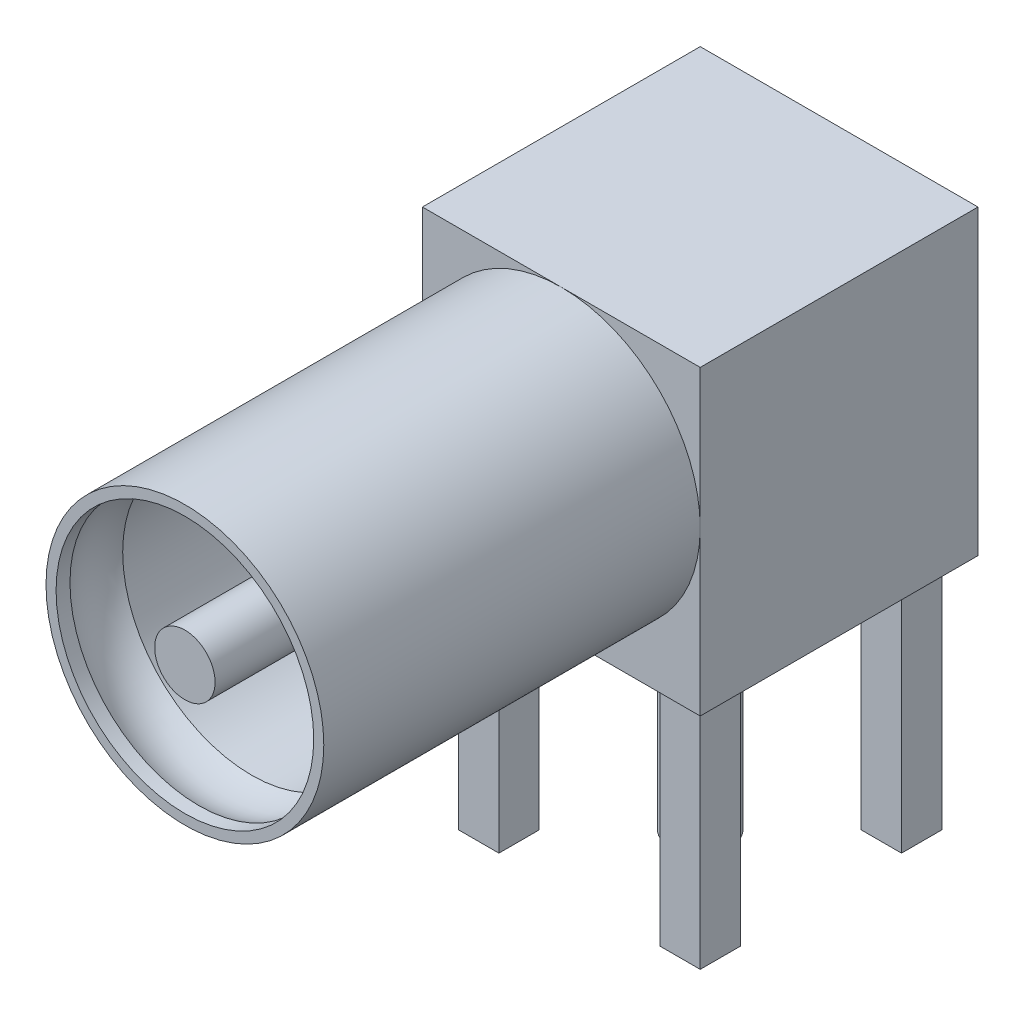
ISO-10303-21;
HEADER;
FILE_DESCRIPTION(('STEP AP214'),'2;1');
FILE_NAME('part.step','',(''),(''),'','','');
FILE_SCHEMA(('AUTOMOTIVE_DESIGN { 1 0 10303 214 1 1 1 1 }'));
ENDSEC;
DATA;
#1=APPLICATION_CONTEXT('core data for automotive mechanical design processes');
#2=APPLICATION_PROTOCOL_DEFINITION('international standard','automotive_design',2000,#1);
#3=PRODUCT_CONTEXT('',#1,'mechanical');
#4=PRODUCT('Part','Part','',(#3));
#5=PRODUCT_RELATED_PRODUCT_CATEGORY('part','',(#4));
#6=PRODUCT_DEFINITION_FORMATION('','',#4);
#7=PRODUCT_DEFINITION_CONTEXT('part definition',#1,'design');
#8=PRODUCT_DEFINITION('design','',#6,#7);
#9=PRODUCT_DEFINITION_SHAPE('','',#8);
#10=(LENGTH_UNIT() NAMED_UNIT(*) SI_UNIT(.MILLI.,.METRE.));
#11=(NAMED_UNIT(*) PLANE_ANGLE_UNIT() SI_UNIT($,.RADIAN.));
#12=(NAMED_UNIT(*) SI_UNIT($,.STERADIAN.) SOLID_ANGLE_UNIT());
#13=UNCERTAINTY_MEASURE_WITH_UNIT(LENGTH_MEASURE(1.E-05),#10,'distance_accuracy_value','');
#14=(GEOMETRIC_REPRESENTATION_CONTEXT(3) GLOBAL_UNCERTAINTY_ASSIGNED_CONTEXT((#13)) GLOBAL_UNIT_ASSIGNED_CONTEXT((#10,
#11,#12)) REPRESENTATION_CONTEXT('',''));
#15=CARTESIAN_POINT('',(0.,0.,0.));
#16=DIRECTION('',(0.,0.,1.));
#17=DIRECTION('',(1.,0.,0.));
#18=AXIS2_PLACEMENT_3D('',#15,#16,#17);
#19=CARTESIAN_POINT('',(0.,2.0574,4.2164));
#20=DIRECTION('',(0.,0.,1.));
#21=DIRECTION('',(1.,0.,0.));
#22=AXIS2_PLACEMENT_3D('',#19,#20,#21);
#23=CYLINDRICAL_SURFACE('',#22,1.6256);
#24=CARTESIAN_POINT('',(0.,2.0574,6.3270333416842));
#25=DIRECTION('',(0.,0.,-1.));
#26=DIRECTION('',(-1.,0.,0.));
#27=AXIS2_PLACEMENT_3D('',#24,#25,#26);
#28=CIRCLE('',#27,1.6256);
#29=CARTESIAN_POINT('',(-1.6256,2.0574,6.3270333416842));
#30=VERTEX_POINT('',#29);
#31=EDGE_CURVE('E710',#30,#30,#28,.T.);
#32=ORIENTED_EDGE('',*,*,#31,.T.);
#33=EDGE_LOOP('',(#32));
#34=FACE_BOUND('',#33,.T.);
#35=CARTESIAN_POINT('',(0.,2.0574,6.5024));
#36=DIRECTION('',(0.,0.,1.));
#37=DIRECTION('',(1.,0.,0.));
#38=AXIS2_PLACEMENT_3D('',#35,#36,#37);
#39=CIRCLE('',#38,1.6256);
#40=CARTESIAN_POINT('',(1.6256,2.0574,6.5024));
#41=VERTEX_POINT('',#40);
#42=EDGE_CURVE('E407',#41,#41,#39,.T.);
#43=ORIENTED_EDGE('',*,*,#42,.T.);
#44=EDGE_LOOP('',(#43));
#45=FACE_BOUND('',#44,.T.);
#46=ADVANCED_FACE('F35',(#34,#45),#23,.F.);
#47=CARTESIAN_POINT('',(0.,0.,0.));
#48=DIRECTION('',(0.,-1.,0.));
#49=DIRECTION('',(0.,0.,-1.));
#50=AXIS2_PLACEMENT_3D('',#47,#48,#49);
#51=PLANE('',#50);
#52=CARTESIAN_POINT('',(0.,0.,0.));
#53=DIRECTION('',(0.,-1.,0.));
#54=DIRECTION('',(0.,0.,-1.));
#55=AXIS2_PLACEMENT_3D('',#52,#53,#54);
#56=CIRCLE('',#55,1.27);
#57=CARTESIAN_POINT('',(0.,0.,-1.27));
#58=VERTEX_POINT('',#57);
#59=EDGE_CURVE('E410',#58,#58,#56,.T.);
#60=ORIENTED_EDGE('',*,*,#59,.F.);
#61=EDGE_LOOP('',(#60));
#62=FACE_BOUND('',#61,.T.);
#63=DIRECTION('',(0.,0.,-1.));
#64=VECTOR('',#63,1.);
#65=CARTESIAN_POINT('',(1.7526,0.,1.7526));
#66=LINE('',#65,#64);
#67=CARTESIAN_POINT('',(1.7526,0.,1.7526));
#68=VERTEX_POINT('',#67);
#69=CARTESIAN_POINT('',(1.7526,0.,-1.7526));
#70=VERTEX_POINT('',#69);
#71=EDGE_CURVE('E304',#68,#70,#66,.T.);
#72=ORIENTED_EDGE('',*,*,#71,.F.);
#73=DIRECTION('',(1.,0.,0.));
#74=VECTOR('',#73,1.);
#75=CARTESIAN_POINT('',(-1.7526,0.,1.7526));
#76=LINE('',#75,#74);
#77=CARTESIAN_POINT('',(-1.7526,0.,1.7526));
#78=VERTEX_POINT('',#77);
#79=EDGE_CURVE('E311',#78,#68,#76,.T.);
#80=ORIENTED_EDGE('',*,*,#79,.F.);
#81=DIRECTION('',(0.,0.,1.));
#82=VECTOR('',#81,1.);
#83=CARTESIAN_POINT('',(-1.7526,0.,1.7526));
#84=LINE('',#83,#82);
#85=CARTESIAN_POINT('',(-1.7526,0.,-1.7526));
#86=VERTEX_POINT('',#85);
#87=EDGE_CURVE('E324',#86,#78,#84,.T.);
#88=ORIENTED_EDGE('',*,*,#87,.F.);
#89=DIRECTION('',(-1.,0.,0.));
#90=VECTOR('',#89,1.);
#91=CARTESIAN_POINT('',(-1.7526,0.,-1.7526));
#92=LINE('',#91,#90);
#93=EDGE_CURVE('E322',#70,#86,#92,.T.);
#94=ORIENTED_EDGE('',*,*,#93,.F.);
#95=EDGE_LOOP('',(#72,#80,#88,#94));
#96=FACE_BOUND('',#95,.T.);
#97=DIRECTION('',(1.,0.,0.));
#98=VECTOR('',#97,1.);
#99=CARTESIAN_POINT('',(1.524,0.,1.016));
#100=LINE('',#99,#98);
#101=CARTESIAN_POINT('',(1.016,0.,1.016));
#102=VERTEX_POINT('',#101);
#103=CARTESIAN_POINT('',(1.524,0.,1.016));
#104=VERTEX_POINT('',#103);
#105=EDGE_CURVE('E287',#102,#104,#100,.T.);
#106=ORIENTED_EDGE('',*,*,#105,.F.);
#107=DIRECTION('',(0.,0.,-1.));
#108=VECTOR('',#107,1.);
#109=CARTESIAN_POINT('',(1.016,0.,1.524));
#110=LINE('',#109,#108);
#111=CARTESIAN_POINT('',(1.016,0.,1.524));
#112=VERTEX_POINT('',#111);
#113=EDGE_CURVE('E273',#112,#102,#110,.T.);
#114=ORIENTED_EDGE('',*,*,#113,.F.);
#115=DIRECTION('',(-1.,0.,0.));
#116=VECTOR('',#115,1.);
#117=CARTESIAN_POINT('',(1.524,0.,1.524));
#118=LINE('',#117,#116);
#119=CARTESIAN_POINT('',(1.524,0.,1.524));
#120=VERTEX_POINT('',#119);
#121=EDGE_CURVE('E278',#120,#112,#118,.T.);
#122=ORIENTED_EDGE('',*,*,#121,.F.);
#123=DIRECTION('',(0.,0.,1.));
#124=VECTOR('',#123,1.);
#125=CARTESIAN_POINT('',(1.524,0.,1.524));
#126=LINE('',#125,#124);
#127=EDGE_CURVE('E289',#104,#120,#126,.T.);
#128=ORIENTED_EDGE('',*,*,#127,.F.);
#129=EDGE_LOOP('',(#106,#114,#122,#128));
#130=FACE_BOUND('',#129,.T.);
#131=DIRECTION('',(0.,0.,1.));
#132=VECTOR('',#131,1.);
#133=CARTESIAN_POINT('',(-1.016,0.,1.524));
#134=LINE('',#133,#132);
#135=CARTESIAN_POINT('',(-1.016,0.,1.016));
#136=VERTEX_POINT('',#135);
#137=CARTESIAN_POINT('',(-1.016,0.,1.524));
#138=VERTEX_POINT('',#137);
#139=EDGE_CURVE('E255',#136,#138,#134,.T.);
#140=ORIENTED_EDGE('',*,*,#139,.F.);
#141=DIRECTION('',(1.,0.,0.));
#142=VECTOR('',#141,1.);
#143=CARTESIAN_POINT('',(-1.016,0.,1.016));
#144=LINE('',#143,#142);
#145=CARTESIAN_POINT('',(-1.524,0.,1.016));
#146=VERTEX_POINT('',#145);
#147=EDGE_CURVE('E241',#146,#136,#144,.T.);
#148=ORIENTED_EDGE('',*,*,#147,.F.);
#149=DIRECTION('',(0.,0.,-1.));
#150=VECTOR('',#149,1.);
#151=CARTESIAN_POINT('',(-1.524,0.,1.524));
#152=LINE('',#151,#150);
#153=CARTESIAN_POINT('',(-1.524,0.,1.524));
#154=VERTEX_POINT('',#153);
#155=EDGE_CURVE('E246',#154,#146,#152,.T.);
#156=ORIENTED_EDGE('',*,*,#155,.F.);
#157=DIRECTION('',(-1.,0.,0.));
#158=VECTOR('',#157,1.);
#159=CARTESIAN_POINT('',(-1.016,0.,1.524));
#160=LINE('',#159,#158);
#161=EDGE_CURVE('E257',#138,#154,#160,.T.);
#162=ORIENTED_EDGE('',*,*,#161,.F.);
#163=EDGE_LOOP('',(#140,#148,#156,#162));
#164=FACE_BOUND('',#163,.T.);
#165=DIRECTION('',(0.,0.,1.));
#166=VECTOR('',#165,1.);
#167=CARTESIAN_POINT('',(-1.01599999999997,0.,-1.016));
#168=LINE('',#167,#166);
#169=CARTESIAN_POINT('',(-1.01599999999997,0.,-1.524));
#170=VERTEX_POINT('',#169);
#171=CARTESIAN_POINT('',(-1.01599999999997,0.,-1.016));
#172=VERTEX_POINT('',#171);
#173=EDGE_CURVE('E213',#170,#172,#168,.T.);
#174=ORIENTED_EDGE('',*,*,#173,.F.);
#175=DIRECTION('',(1.,0.,0.));
#176=VECTOR('',#175,1.);
#177=CARTESIAN_POINT('',(-1.01599999999997,0.,-1.524));
#178=LINE('',#177,#176);
#179=CARTESIAN_POINT('',(-1.52399999999997,0.,-1.524));
#180=VERTEX_POINT('',#179);
#181=EDGE_CURVE('E210',#180,#170,#178,.T.);
#182=ORIENTED_EDGE('',*,*,#181,.F.);
#183=DIRECTION('',(0.,0.,-1.));
#184=VECTOR('',#183,1.);
#185=CARTESIAN_POINT('',(-1.52399999999997,0.,-1.016));
#186=LINE('',#185,#184);
#187=CARTESIAN_POINT('',(-1.52399999999997,0.,-1.016));
#188=VERTEX_POINT('',#187);
#189=EDGE_CURVE('E222',#188,#180,#186,.T.);
#190=ORIENTED_EDGE('',*,*,#189,.F.);
#191=DIRECTION('',(-1.,0.,0.));
#192=VECTOR('',#191,1.);
#193=CARTESIAN_POINT('',(-1.01599999999997,0.,-1.016));
#194=LINE('',#193,#192);
#195=EDGE_CURVE('E230',#172,#188,#194,.T.);
#196=ORIENTED_EDGE('',*,*,#195,.F.);
#197=EDGE_LOOP('',(#174,#182,#190,#196));
#198=FACE_BOUND('',#197,.T.);
#199=DIRECTION('',(0.,0.,1.));
#200=VECTOR('',#199,1.);
#201=CARTESIAN_POINT('',(1.52400000000003,0.,-1.016));
#202=LINE('',#201,#200);
#203=CARTESIAN_POINT('',(1.52400000000003,0.,-1.524));
#204=VERTEX_POINT('',#203);
#205=CARTESIAN_POINT('',(1.52400000000003,0.,-1.016));
#206=VERTEX_POINT('',#205);
#207=EDGE_CURVE('E428',#204,#206,#202,.T.);
#208=ORIENTED_EDGE('',*,*,#207,.F.);
#209=DIRECTION('',(1.,0.,0.));
#210=VECTOR('',#209,1.);
#211=CARTESIAN_POINT('',(1.52400000000003,0.,-1.524));
#212=LINE('',#211,#210);
#213=CARTESIAN_POINT('',(1.01600000000003,0.,-1.524));
#214=VERTEX_POINT('',#213);
#215=EDGE_CURVE('E208',#214,#204,#212,.T.);
#216=ORIENTED_EDGE('',*,*,#215,.F.);
#217=DIRECTION('',(0.,0.,-1.));
#218=VECTOR('',#217,1.);
#219=CARTESIAN_POINT('',(1.01600000000003,0.,-1.016));
#220=LINE('',#219,#218);
#221=CARTESIAN_POINT('',(1.01600000000003,0.,-1.016));
#222=VERTEX_POINT('',#221);
#223=EDGE_CURVE('E204',#222,#214,#220,.T.);
#224=ORIENTED_EDGE('',*,*,#223,.F.);
#225=DIRECTION('',(-1.,0.,0.));
#226=VECTOR('',#225,1.);
#227=CARTESIAN_POINT('',(1.52400000000003,0.,-1.016));
#228=LINE('',#227,#226);
#229=EDGE_CURVE('E430',#206,#222,#228,.T.);
#230=ORIENTED_EDGE('',*,*,#229,.F.);
#231=EDGE_LOOP('',(#208,#216,#224,#230));
#232=FACE_BOUND('',#231,.T.);
#233=ADVANCED_FACE('F365',(#62,#96,#130,#164,#198,#232),#51,.T.);
#234=CARTESIAN_POINT('',(-1.7526,3.81,1.7526));
#235=DIRECTION('',(0.,0.,-1.));
#236=DIRECTION('',(-1.,0.,0.));
#237=AXIS2_PLACEMENT_3D('',#234,#235,#236);
#238=PLANE('',#237);
#239=CARTESIAN_POINT('',(0.,2.0574,1.7526));
#240=DIRECTION('',(0.,0.,1.));
#241=DIRECTION('',(1.,0.,0.));
#242=AXIS2_PLACEMENT_3D('',#239,#240,#241);
#243=CIRCLE('',#242,1.7526);
#244=CARTESIAN_POINT('',(1.7526,2.0574,1.7526));
#245=VERTEX_POINT('',#244);
#246=CARTESIAN_POINT('',(0.,3.81,1.7526));
#247=VERTEX_POINT('',#246);
#248=EDGE_CURVE('E46',#245,#247,#243,.T.);
#249=ORIENTED_EDGE('',*,*,#248,.F.);
#250=DIRECTION('',(0.,-1.,0.));
#251=VECTOR('',#250,1.);
#252=CARTESIAN_POINT('',(1.7526,3.81,1.7526));
#253=LINE('',#252,#251);
#254=CARTESIAN_POINT('',(1.7526,3.81,1.7526));
#255=VERTEX_POINT('',#254);
#256=EDGE_CURVE('E329',#255,#245,#253,.T.);
#257=ORIENTED_EDGE('',*,*,#256,.F.);
#258=DIRECTION('',(1.,0.,0.));
#259=VECTOR('',#258,1.);
#260=CARTESIAN_POINT('',(-1.7526,3.81,1.7526));
#261=LINE('',#260,#259);
#262=EDGE_CURVE('E315',#247,#255,#261,.T.);
#263=ORIENTED_EDGE('',*,*,#262,.F.);
#264=EDGE_LOOP('',(#249,#257,#263));
#265=FACE_BOUND('',#264,.T.);
#266=ADVANCED_FACE('F369',(#265),#238,.F.);
#267=CARTESIAN_POINT('',(-1.7526,2.0574,1.7526));
#268=VERTEX_POINT('',#267);
#269=EDGE_CURVE('E11',#247,#268,#243,.T.);
#270=ORIENTED_EDGE('',*,*,#269,.F.);
#271=CARTESIAN_POINT('',(-1.7526,3.81,1.7526));
#272=VERTEX_POINT('',#271);
#273=EDGE_CURVE('E316',#272,#247,#261,.T.);
#274=ORIENTED_EDGE('',*,*,#273,.F.);
#275=DIRECTION('',(0.,-1.,0.));
#276=VECTOR('',#275,1.);
#277=CARTESIAN_POINT('',(-1.7526,3.81,1.7526));
#278=LINE('',#277,#276);
#279=EDGE_CURVE('E332',#272,#268,#278,.T.);
#280=ORIENTED_EDGE('',*,*,#279,.T.);
#281=EDGE_LOOP('',(#270,#274,#280));
#282=FACE_BOUND('',#281,.T.);
#283=ADVANCED_FACE('F356',(#282),#238,.F.);
#284=CARTESIAN_POINT('',(1.7526,3.81,1.7526));
#285=DIRECTION('',(-1.,0.,0.));
#286=DIRECTION('',(0.,0.,1.));
#287=AXIS2_PLACEMENT_3D('',#284,#285,#286);
#288=PLANE('',#287);
#289=ORIENTED_EDGE('',*,*,#71,.T.);
#290=DIRECTION('',(0.,-1.,0.));
#291=VECTOR('',#290,1.);
#292=CARTESIAN_POINT('',(1.7526,3.81,-1.7526));
#293=LINE('',#292,#291);
#294=CARTESIAN_POINT('',(1.7526,3.81,-1.7526));
#295=VERTEX_POINT('',#294);
#296=EDGE_CURVE('E39',#295,#70,#293,.T.);
#297=ORIENTED_EDGE('',*,*,#296,.F.);
#298=DIRECTION('',(0.,0.,-1.));
#299=VECTOR('',#298,1.);
#300=CARTESIAN_POINT('',(1.7526,3.81,1.7526));
#301=LINE('',#300,#299);
#302=EDGE_CURVE('E307',#255,#295,#301,.T.);
#303=ORIENTED_EDGE('',*,*,#302,.F.);
#304=ORIENTED_EDGE('',*,*,#256,.T.);
#305=EDGE_CURVE('E319',#245,#68,#253,.T.);
#306=ORIENTED_EDGE('',*,*,#305,.T.);
#307=EDGE_LOOP('',(#289,#297,#303,#304,#306));
#308=FACE_BOUND('',#307,.T.);
#309=ADVANCED_FACE('F37',(#308),#288,.F.);
#310=CARTESIAN_POINT('',(-1.7526,3.81,-1.7526));
#311=DIRECTION('',(0.,0.,1.));
#312=DIRECTION('',(1.,0.,0.));
#313=AXIS2_PLACEMENT_3D('',#310,#311,#312);
#314=PLANE('',#313);
#315=ORIENTED_EDGE('',*,*,#93,.T.);
#316=DIRECTION('',(0.,-1.,0.));
#317=VECTOR('',#316,1.);
#318=CARTESIAN_POINT('',(-1.7526,3.81,-1.7526));
#319=LINE('',#318,#317);
#320=CARTESIAN_POINT('',(-1.7526,3.81,-1.7526));
#321=VERTEX_POINT('',#320);
#322=EDGE_CURVE('E334',#321,#86,#319,.T.);
#323=ORIENTED_EDGE('',*,*,#322,.F.);
#324=DIRECTION('',(-1.,0.,0.));
#325=VECTOR('',#324,1.);
#326=CARTESIAN_POINT('',(-1.7526,3.81,-1.7526));
#327=LINE('',#326,#325);
#328=EDGE_CURVE('E310',#295,#321,#327,.T.);
#329=ORIENTED_EDGE('',*,*,#328,.F.);
#330=ORIENTED_EDGE('',*,*,#296,.T.);
#331=EDGE_LOOP('',(#315,#323,#329,#330));
#332=FACE_BOUND('',#331,.T.);
#333=ADVANCED_FACE('F362',(#332),#314,.F.);
#334=CARTESIAN_POINT('',(-1.7526,3.81,1.7526));
#335=DIRECTION('',(1.,0.,0.));
#336=DIRECTION('',(0.,0.,-1.));
#337=AXIS2_PLACEMENT_3D('',#334,#335,#336);
#338=PLANE('',#337);
#339=ORIENTED_EDGE('',*,*,#87,.T.);
#340=EDGE_CURVE('E331',#268,#78,#278,.T.);
#341=ORIENTED_EDGE('',*,*,#340,.F.);
#342=ORIENTED_EDGE('',*,*,#279,.F.);
#343=DIRECTION('',(0.,0.,1.));
#344=VECTOR('',#343,1.);
#345=CARTESIAN_POINT('',(-1.7526,3.81,1.7526));
#346=LINE('',#345,#344);
#347=EDGE_CURVE('E313',#321,#272,#346,.T.);
#348=ORIENTED_EDGE('',*,*,#347,.F.);
#349=ORIENTED_EDGE('',*,*,#322,.T.);
#350=EDGE_LOOP('',(#339,#341,#342,#348,#349));
#351=FACE_BOUND('',#350,.T.);
#352=ADVANCED_FACE('F352',(#351),#338,.F.);
#353=EDGE_CURVE('E44',#268,#245,#243,.T.);
#354=ORIENTED_EDGE('',*,*,#353,.F.);
#355=ORIENTED_EDGE('',*,*,#340,.T.);
#356=ORIENTED_EDGE('',*,*,#79,.T.);
#357=ORIENTED_EDGE('',*,*,#305,.F.);
#358=EDGE_LOOP('',(#354,#355,#356,#357));
#359=FACE_BOUND('',#358,.T.);
#360=ADVANCED_FACE('F350',(#359),#238,.F.);
#361=CARTESIAN_POINT('',(0.,3.81,0.));
#362=DIRECTION('',(0.,-1.,0.));
#363=DIRECTION('',(0.,0.,-1.));
#364=AXIS2_PLACEMENT_3D('',#361,#362,#363);
#365=PLANE('',#364);
#366=ORIENTED_EDGE('',*,*,#302,.T.);
#367=ORIENTED_EDGE('',*,*,#328,.T.);
#368=ORIENTED_EDGE('',*,*,#347,.T.);
#369=ORIENTED_EDGE('',*,*,#273,.T.);
#370=ORIENTED_EDGE('',*,*,#262,.T.);
#371=EDGE_LOOP('',(#366,#367,#368,#369,#370));
#372=FACE_BOUND('',#371,.T.);
#373=ADVANCED_FACE('F359',(#372),#365,.F.);
#374=CARTESIAN_POINT('',(0.,2.0574,6.5024));
#375=DIRECTION('',(0.,0.,-1.));
#376=DIRECTION('',(-1.,0.,0.));
#377=AXIS2_PLACEMENT_3D('',#374,#375,#376);
#378=CYLINDRICAL_SURFACE('',#377,1.7526);
#379=CARTESIAN_POINT('',(0.,2.0574,6.5024));
#380=DIRECTION('',(0.,0.,1.));
#381=DIRECTION('',(1.,0.,0.));
#382=AXIS2_PLACEMENT_3D('',#379,#380,#381);
#383=CIRCLE('',#382,1.7526);
#384=CARTESIAN_POINT('',(1.7526,2.0574,6.5024));
#385=VERTEX_POINT('',#384);
#386=EDGE_CURVE('E302',#385,#385,#383,.T.);
#387=ORIENTED_EDGE('',*,*,#386,.F.);
#388=EDGE_LOOP('',(#387));
#389=FACE_BOUND('',#388,.T.);
#390=ORIENTED_EDGE('',*,*,#248,.T.);
#391=ORIENTED_EDGE('',*,*,#269,.T.);
#392=ORIENTED_EDGE('',*,*,#353,.T.);
#393=EDGE_LOOP('',(#390,#391,#392));
#394=FACE_BOUND('',#393,.T.);
#395=ADVANCED_FACE('F345',(#389,#394),#378,.T.);
#396=CARTESIAN_POINT('',(0.,2.0574,6.5024));
#397=DIRECTION('',(0.,0.,1.));
#398=DIRECTION('',(1.,0.,0.));
#399=AXIS2_PLACEMENT_3D('',#396,#397,#398);
#400=PLANE('',#399);
#401=ORIENTED_EDGE('',*,*,#42,.F.);
#402=EDGE_LOOP('',(#401));
#403=FACE_BOUND('',#402,.T.);
#404=ORIENTED_EDGE('',*,*,#386,.T.);
#405=EDGE_LOOP('',(#404));
#406=FACE_BOUND('',#405,.T.);
#407=ADVANCED_FACE('F522',(#403,#406),#400,.T.);
#408=CARTESIAN_POINT('',(1.016,-2.9972,1.524));
#409=DIRECTION('',(1.,0.,0.));
#410=DIRECTION('',(0.,0.,-1.));
#411=AXIS2_PLACEMENT_3D('',#408,#409,#410);
#412=PLANE('',#411);
#413=ORIENTED_EDGE('',*,*,#113,.T.);
#414=DIRECTION('',(0.,1.,0.));
#415=VECTOR('',#414,1.);
#416=CARTESIAN_POINT('',(1.016,-2.9972,1.016));
#417=LINE('',#416,#415);
#418=CARTESIAN_POINT('',(1.016,-2.9972,1.016));
#419=VERTEX_POINT('',#418);
#420=EDGE_CURVE('E300',#419,#102,#417,.T.);
#421=ORIENTED_EDGE('',*,*,#420,.F.);
#422=DIRECTION('',(0.,0.,-1.));
#423=VECTOR('',#422,1.);
#424=CARTESIAN_POINT('',(1.016,-2.9972,1.524));
#425=LINE('',#424,#423);
#426=CARTESIAN_POINT('',(1.016,-2.9972,1.524));
#427=VERTEX_POINT('',#426);
#428=EDGE_CURVE('E274',#427,#419,#425,.T.);
#429=ORIENTED_EDGE('',*,*,#428,.F.);
#430=DIRECTION('',(0.,1.,0.));
#431=VECTOR('',#430,1.);
#432=CARTESIAN_POINT('',(1.016,-2.9972,1.524));
#433=LINE('',#432,#431);
#434=EDGE_CURVE('E284',#427,#112,#433,.T.);
#435=ORIENTED_EDGE('',*,*,#434,.T.);
#436=EDGE_LOOP('',(#413,#421,#429,#435));
#437=FACE_BOUND('',#436,.T.);
#438=ADVANCED_FACE('F518',(#437),#412,.F.);
#439=CARTESIAN_POINT('',(1.524,-2.9972,1.016));
#440=DIRECTION('',(0.,0.,1.));
#441=DIRECTION('',(1.,0.,0.));
#442=AXIS2_PLACEMENT_3D('',#439,#440,#441);
#443=PLANE('',#442);
#444=ORIENTED_EDGE('',*,*,#105,.T.);
#445=DIRECTION('',(0.,1.,0.));
#446=VECTOR('',#445,1.);
#447=CARTESIAN_POINT('',(1.524,-2.9972,1.016));
#448=LINE('',#447,#446);
#449=CARTESIAN_POINT('',(1.524,-2.9972,1.016));
#450=VERTEX_POINT('',#449);
#451=EDGE_CURVE('E297',#450,#104,#448,.T.);
#452=ORIENTED_EDGE('',*,*,#451,.F.);
#453=DIRECTION('',(1.,0.,0.));
#454=VECTOR('',#453,1.);
#455=CARTESIAN_POINT('',(1.524,-2.9972,1.016));
#456=LINE('',#455,#454);
#457=EDGE_CURVE('E277',#419,#450,#456,.T.);
#458=ORIENTED_EDGE('',*,*,#457,.F.);
#459=ORIENTED_EDGE('',*,*,#420,.T.);
#460=EDGE_LOOP('',(#444,#452,#458,#459));
#461=FACE_BOUND('',#460,.T.);
#462=ADVANCED_FACE('F514',(#461),#443,.F.);
#463=CARTESIAN_POINT('',(1.524,-2.9972,1.524));
#464=DIRECTION('',(-1.,0.,0.));
#465=DIRECTION('',(0.,0.,1.));
#466=AXIS2_PLACEMENT_3D('',#463,#464,#465);
#467=PLANE('',#466);
#468=ORIENTED_EDGE('',*,*,#127,.T.);
#469=DIRECTION('',(0.,1.,0.));
#470=VECTOR('',#469,1.);
#471=CARTESIAN_POINT('',(1.524,-2.9972,1.524));
#472=LINE('',#471,#470);
#473=CARTESIAN_POINT('',(1.524,-2.9972,1.524));
#474=VERTEX_POINT('',#473);
#475=EDGE_CURVE('E295',#474,#120,#472,.T.);
#476=ORIENTED_EDGE('',*,*,#475,.F.);
#477=DIRECTION('',(0.,0.,1.));
#478=VECTOR('',#477,1.);
#479=CARTESIAN_POINT('',(1.524,-2.9972,1.524));
#480=LINE('',#479,#478);
#481=EDGE_CURVE('E280',#450,#474,#480,.T.);
#482=ORIENTED_EDGE('',*,*,#481,.F.);
#483=ORIENTED_EDGE('',*,*,#451,.T.);
#484=EDGE_LOOP('',(#468,#476,#482,#483));
#485=FACE_BOUND('',#484,.T.);
#486=ADVANCED_FACE('F510',(#485),#467,.F.);
#487=CARTESIAN_POINT('',(1.524,-2.9972,1.524));
#488=DIRECTION('',(0.,0.,-1.));
#489=DIRECTION('',(-1.,0.,0.));
#490=AXIS2_PLACEMENT_3D('',#487,#488,#489);
#491=PLANE('',#490);
#492=ORIENTED_EDGE('',*,*,#121,.T.);
#493=ORIENTED_EDGE('',*,*,#434,.F.);
#494=DIRECTION('',(-1.,0.,0.));
#495=VECTOR('',#494,1.);
#496=CARTESIAN_POINT('',(1.524,-2.9972,1.524));
#497=LINE('',#496,#495);
#498=EDGE_CURVE('E282',#474,#427,#497,.T.);
#499=ORIENTED_EDGE('',*,*,#498,.F.);
#500=ORIENTED_EDGE('',*,*,#475,.T.);
#501=EDGE_LOOP('',(#492,#493,#499,#500));
#502=FACE_BOUND('',#501,.T.);
#503=ADVANCED_FACE('F506',(#502),#491,.F.);
#504=CARTESIAN_POINT('',(0.,-2.9972,0.));
#505=DIRECTION('',(0.,1.,0.));
#506=DIRECTION('',(0.,0.,1.));
#507=AXIS2_PLACEMENT_3D('',#504,#505,#506);
#508=PLANE('',#507);
#509=ORIENTED_EDGE('',*,*,#428,.T.);
#510=ORIENTED_EDGE('',*,*,#457,.T.);
#511=ORIENTED_EDGE('',*,*,#481,.T.);
#512=ORIENTED_EDGE('',*,*,#498,.T.);
#513=EDGE_LOOP('',(#509,#510,#511,#512));
#514=FACE_BOUND('',#513,.T.);
#515=ADVANCED_FACE('F492',(#514),#508,.F.);
#516=CARTESIAN_POINT('',(-1.016,-2.9972,1.016));
#517=DIRECTION('',(0.,0.,1.));
#518=DIRECTION('',(1.,0.,0.));
#519=AXIS2_PLACEMENT_3D('',#516,#517,#518);
#520=PLANE('',#519);
#521=ORIENTED_EDGE('',*,*,#147,.T.);
#522=DIRECTION('',(0.,1.,0.));
#523=VECTOR('',#522,1.);
#524=CARTESIAN_POINT('',(-1.016,-2.9972,1.016));
#525=LINE('',#524,#523);
#526=CARTESIAN_POINT('',(-1.016,-2.9972,1.016));
#527=VERTEX_POINT('',#526);
#528=EDGE_CURVE('E268',#527,#136,#525,.T.);
#529=ORIENTED_EDGE('',*,*,#528,.F.);
#530=DIRECTION('',(1.,0.,0.));
#531=VECTOR('',#530,1.);
#532=CARTESIAN_POINT('',(-1.016,-2.9972,1.016));
#533=LINE('',#532,#531);
#534=CARTESIAN_POINT('',(-1.524,-2.9972,1.016));
#535=VERTEX_POINT('',#534);
#536=EDGE_CURVE('E242',#535,#527,#533,.T.);
#537=ORIENTED_EDGE('',*,*,#536,.F.);
#538=DIRECTION('',(0.,1.,0.));
#539=VECTOR('',#538,1.);
#540=CARTESIAN_POINT('',(-1.524,-2.9972,1.016));
#541=LINE('',#540,#539);
#542=EDGE_CURVE('E252',#535,#146,#541,.T.);
#543=ORIENTED_EDGE('',*,*,#542,.T.);
#544=EDGE_LOOP('',(#521,#529,#537,#543));
#545=FACE_BOUND('',#544,.T.);
#546=ADVANCED_FACE('F488',(#545),#520,.F.);
#547=CARTESIAN_POINT('',(-1.016,-2.9972,1.524));
#548=DIRECTION('',(-1.,0.,0.));
#549=DIRECTION('',(0.,0.,1.));
#550=AXIS2_PLACEMENT_3D('',#547,#548,#549);
#551=PLANE('',#550);
#552=ORIENTED_EDGE('',*,*,#139,.T.);
#553=DIRECTION('',(0.,1.,0.));
#554=VECTOR('',#553,1.);
#555=CARTESIAN_POINT('',(-1.016,-2.9972,1.524));
#556=LINE('',#555,#554);
#557=CARTESIAN_POINT('',(-1.016,-2.9972,1.524));
#558=VERTEX_POINT('',#557);
#559=EDGE_CURVE('E265',#558,#138,#556,.T.);
#560=ORIENTED_EDGE('',*,*,#559,.F.);
#561=DIRECTION('',(0.,0.,1.));
#562=VECTOR('',#561,1.);
#563=CARTESIAN_POINT('',(-1.016,-2.9972,1.524));
#564=LINE('',#563,#562);
#565=EDGE_CURVE('E245',#527,#558,#564,.T.);
#566=ORIENTED_EDGE('',*,*,#565,.F.);
#567=ORIENTED_EDGE('',*,*,#528,.T.);
#568=EDGE_LOOP('',(#552,#560,#566,#567));
#569=FACE_BOUND('',#568,.T.);
#570=ADVANCED_FACE('F484',(#569),#551,.F.);
#571=CARTESIAN_POINT('',(-1.016,-2.9972,1.524));
#572=DIRECTION('',(0.,0.,-1.));
#573=DIRECTION('',(-1.,0.,0.));
#574=AXIS2_PLACEMENT_3D('',#571,#572,#573);
#575=PLANE('',#574);
#576=ORIENTED_EDGE('',*,*,#161,.T.);
#577=DIRECTION('',(0.,1.,0.));
#578=VECTOR('',#577,1.);
#579=CARTESIAN_POINT('',(-1.524,-2.9972,1.524));
#580=LINE('',#579,#578);
#581=CARTESIAN_POINT('',(-1.524,-2.9972,1.524));
#582=VERTEX_POINT('',#581);
#583=EDGE_CURVE('E263',#582,#154,#580,.T.);
#584=ORIENTED_EDGE('',*,*,#583,.F.);
#585=DIRECTION('',(-1.,0.,0.));
#586=VECTOR('',#585,1.);
#587=CARTESIAN_POINT('',(-1.016,-2.9972,1.524));
#588=LINE('',#587,#586);
#589=EDGE_CURVE('E248',#558,#582,#588,.T.);
#590=ORIENTED_EDGE('',*,*,#589,.F.);
#591=ORIENTED_EDGE('',*,*,#559,.T.);
#592=EDGE_LOOP('',(#576,#584,#590,#591));
#593=FACE_BOUND('',#592,.T.);
#594=ADVANCED_FACE('F480',(#593),#575,.F.);
#595=CARTESIAN_POINT('',(-1.524,-2.9972,1.524));
#596=DIRECTION('',(1.,0.,0.));
#597=DIRECTION('',(0.,0.,-1.));
#598=AXIS2_PLACEMENT_3D('',#595,#596,#597);
#599=PLANE('',#598);
#600=ORIENTED_EDGE('',*,*,#155,.T.);
#601=ORIENTED_EDGE('',*,*,#542,.F.);
#602=DIRECTION('',(0.,0.,-1.));
#603=VECTOR('',#602,1.);
#604=CARTESIAN_POINT('',(-1.524,-2.9972,1.524));
#605=LINE('',#604,#603);
#606=EDGE_CURVE('E250',#582,#535,#605,.T.);
#607=ORIENTED_EDGE('',*,*,#606,.F.);
#608=ORIENTED_EDGE('',*,*,#583,.T.);
#609=EDGE_LOOP('',(#600,#601,#607,#608));
#610=FACE_BOUND('',#609,.T.);
#611=ADVANCED_FACE('F476',(#610),#599,.F.);
#612=CARTESIAN_POINT('',(0.,-2.9972,0.));
#613=DIRECTION('',(0.,-1.,0.));
#614=DIRECTION('',(0.,0.,-1.));
#615=AXIS2_PLACEMENT_3D('',#612,#613,#614);
#616=PLANE('',#615);
#617=ORIENTED_EDGE('',*,*,#536,.T.);
#618=ORIENTED_EDGE('',*,*,#565,.T.);
#619=ORIENTED_EDGE('',*,*,#589,.T.);
#620=ORIENTED_EDGE('',*,*,#606,.T.);
#621=EDGE_LOOP('',(#617,#618,#619,#620));
#622=FACE_BOUND('',#621,.T.);
#623=ADVANCED_FACE('F472',(#622),#616,.T.);
#624=CARTESIAN_POINT('',(-1.01599999999997,-2.9972,-1.524));
#625=DIRECTION('',(0.,0.,1.));
#626=DIRECTION('',(1.,0.,0.));
#627=AXIS2_PLACEMENT_3D('',#624,#625,#626);
#628=PLANE('',#627);
#629=ORIENTED_EDGE('',*,*,#181,.T.);
#630=DIRECTION('',(0.,1.,0.));
#631=VECTOR('',#630,1.);
#632=CARTESIAN_POINT('',(-1.01599999999997,-2.9972,-1.524));
#633=LINE('',#632,#631);
#634=CARTESIAN_POINT('',(-1.01599999999997,-2.9972,-1.524));
#635=VERTEX_POINT('',#634);
#636=EDGE_CURVE('E239',#635,#170,#633,.T.);
#637=ORIENTED_EDGE('',*,*,#636,.F.);
#638=DIRECTION('',(1.,0.,0.));
#639=VECTOR('',#638,1.);
#640=CARTESIAN_POINT('',(-1.01599999999997,-2.9972,-1.524));
#641=LINE('',#640,#639);
#642=CARTESIAN_POINT('',(-1.52399999999997,-2.9972,-1.524));
#643=VERTEX_POINT('',#642);
#644=EDGE_CURVE('E218',#643,#635,#641,.T.);
#645=ORIENTED_EDGE('',*,*,#644,.F.);
#646=DIRECTION('',(0.,1.,0.));
#647=VECTOR('',#646,1.);
#648=CARTESIAN_POINT('',(-1.52399999999997,-2.9972,-1.524));
#649=LINE('',#648,#647);
#650=EDGE_CURVE('E227',#643,#180,#649,.T.);
#651=ORIENTED_EDGE('',*,*,#650,.T.);
#652=EDGE_LOOP('',(#629,#637,#645,#651));
#653=FACE_BOUND('',#652,.T.);
#654=ADVANCED_FACE('F468',(#653),#628,.F.);
#655=CARTESIAN_POINT('',(-1.01599999999997,-2.9972,-1.016));
#656=DIRECTION('',(-1.,0.,0.));
#657=DIRECTION('',(0.,0.,1.));
#658=AXIS2_PLACEMENT_3D('',#655,#656,#657);
#659=PLANE('',#658);
#660=ORIENTED_EDGE('',*,*,#173,.T.);
#661=DIRECTION('',(0.,1.,0.));
#662=VECTOR('',#661,1.);
#663=CARTESIAN_POINT('',(-1.01599999999997,-2.9972,-1.016));
#664=LINE('',#663,#662);
#665=CARTESIAN_POINT('',(-1.01599999999997,-2.9972,-1.016));
#666=VERTEX_POINT('',#665);
#667=EDGE_CURVE('E236',#666,#172,#664,.T.);
#668=ORIENTED_EDGE('',*,*,#667,.F.);
#669=DIRECTION('',(0.,0.,1.));
#670=VECTOR('',#669,1.);
#671=CARTESIAN_POINT('',(-1.01599999999997,-2.9972,-1.016));
#672=LINE('',#671,#670);
#673=EDGE_CURVE('E221',#635,#666,#672,.T.);
#674=ORIENTED_EDGE('',*,*,#673,.F.);
#675=ORIENTED_EDGE('',*,*,#636,.T.);
#676=EDGE_LOOP('',(#660,#668,#674,#675));
#677=FACE_BOUND('',#676,.T.);
#678=ADVANCED_FACE('F464',(#677),#659,.F.);
#679=CARTESIAN_POINT('',(-1.01599999999997,-2.9972,-1.016));
#680=DIRECTION('',(0.,0.,-1.));
#681=DIRECTION('',(-1.,0.,0.));
#682=AXIS2_PLACEMENT_3D('',#679,#680,#681);
#683=PLANE('',#682);
#684=ORIENTED_EDGE('',*,*,#195,.T.);
#685=DIRECTION('',(0.,1.,0.));
#686=VECTOR('',#685,1.);
#687=CARTESIAN_POINT('',(-1.52399999999997,-2.9972,-1.016));
#688=LINE('',#687,#686);
#689=CARTESIAN_POINT('',(-1.52399999999997,-2.9972,-1.016));
#690=VERTEX_POINT('',#689);
#691=EDGE_CURVE('E61',#690,#188,#688,.T.);
#692=ORIENTED_EDGE('',*,*,#691,.F.);
#693=DIRECTION('',(-1.,0.,0.));
#694=VECTOR('',#693,1.);
#695=CARTESIAN_POINT('',(-1.01599999999997,-2.9972,-1.016));
#696=LINE('',#695,#694);
#697=EDGE_CURVE('E224',#666,#690,#696,.T.);
#698=ORIENTED_EDGE('',*,*,#697,.F.);
#699=ORIENTED_EDGE('',*,*,#667,.T.);
#700=EDGE_LOOP('',(#684,#692,#698,#699));
#701=FACE_BOUND('',#700,.T.);
#702=ADVANCED_FACE('F461',(#701),#683,.F.);
#703=CARTESIAN_POINT('',(-1.52399999999997,-2.9972,-1.016));
#704=DIRECTION('',(1.,0.,0.));
#705=DIRECTION('',(0.,0.,-1.));
#706=AXIS2_PLACEMENT_3D('',#703,#704,#705);
#707=PLANE('',#706);
#708=ORIENTED_EDGE('',*,*,#189,.T.);
#709=ORIENTED_EDGE('',*,*,#650,.F.);
#710=DIRECTION('',(0.,0.,-1.));
#711=VECTOR('',#710,1.);
#712=CARTESIAN_POINT('',(-1.52399999999997,-2.9972,-1.016));
#713=LINE('',#712,#711);
#714=EDGE_CURVE('E226',#690,#643,#713,.T.);
#715=ORIENTED_EDGE('',*,*,#714,.F.);
#716=ORIENTED_EDGE('',*,*,#691,.T.);
#717=EDGE_LOOP('',(#708,#709,#715,#716));
#718=FACE_BOUND('',#717,.T.);
#719=ADVANCED_FACE('F457',(#718),#707,.F.);
#720=CARTESIAN_POINT('',(0.,-2.9972,0.));
#721=DIRECTION('',(0.,-1.,0.));
#722=DIRECTION('',(0.,0.,-1.));
#723=AXIS2_PLACEMENT_3D('',#720,#721,#722);
#724=PLANE('',#723);
#725=ORIENTED_EDGE('',*,*,#644,.T.);
#726=ORIENTED_EDGE('',*,*,#673,.T.);
#727=ORIENTED_EDGE('',*,*,#697,.T.);
#728=ORIENTED_EDGE('',*,*,#714,.T.);
#729=EDGE_LOOP('',(#725,#726,#727,#728));
#730=FACE_BOUND('',#729,.T.);
#731=ADVANCED_FACE('F454',(#730),#724,.T.);
#732=CARTESIAN_POINT('',(1.52400000000003,-2.9972,-1.524));
#733=DIRECTION('',(0.,0.,1.));
#734=DIRECTION('',(1.,0.,0.));
#735=AXIS2_PLACEMENT_3D('',#732,#733,#734);
#736=PLANE('',#735);
#737=ORIENTED_EDGE('',*,*,#215,.T.);
#738=DIRECTION('',(0.,1.,0.));
#739=VECTOR('',#738,1.);
#740=CARTESIAN_POINT('',(1.52400000000003,-2.9972,-1.524));
#741=LINE('',#740,#739);
#742=CARTESIAN_POINT('',(1.52400000000003,-2.9972,-1.524));
#743=VERTEX_POINT('',#742);
#744=EDGE_CURVE('E189',#743,#204,#741,.T.);
#745=ORIENTED_EDGE('',*,*,#744,.F.);
#746=DIRECTION('',(1.,0.,0.));
#747=VECTOR('',#746,1.);
#748=CARTESIAN_POINT('',(1.52400000000003,-2.9972,-1.524));
#749=LINE('',#748,#747);
#750=CARTESIAN_POINT('',(1.01600000000003,-2.9972,-1.524));
#751=VERTEX_POINT('',#750);
#752=EDGE_CURVE('E196',#751,#743,#749,.T.);
#753=ORIENTED_EDGE('',*,*,#752,.F.);
#754=DIRECTION('',(0.,1.,0.));
#755=VECTOR('',#754,1.);
#756=CARTESIAN_POINT('',(1.01600000000003,-2.9972,-1.524));
#757=LINE('',#756,#755);
#758=EDGE_CURVE('E426',#751,#214,#757,.T.);
#759=ORIENTED_EDGE('',*,*,#758,.T.);
#760=EDGE_LOOP('',(#737,#745,#753,#759));
#761=FACE_BOUND('',#760,.T.);
#762=ADVANCED_FACE('F206',(#761),#736,.F.);
#763=CARTESIAN_POINT('',(1.52400000000003,-2.9972,-1.016));
#764=DIRECTION('',(-1.,0.,0.));
#765=DIRECTION('',(0.,0.,1.));
#766=AXIS2_PLACEMENT_3D('',#763,#764,#765);
#767=PLANE('',#766);
#768=ORIENTED_EDGE('',*,*,#207,.T.);
#769=DIRECTION('',(0.,1.,0.));
#770=VECTOR('',#769,1.);
#771=CARTESIAN_POINT('',(1.52400000000003,-2.9972,-1.016));
#772=LINE('',#771,#770);
#773=CARTESIAN_POINT('',(1.52400000000003,-2.9972,-1.016));
#774=VERTEX_POINT('',#773);
#775=EDGE_CURVE('E192',#774,#206,#772,.T.);
#776=ORIENTED_EDGE('',*,*,#775,.F.);
#777=DIRECTION('',(0.,0.,1.));
#778=VECTOR('',#777,1.);
#779=CARTESIAN_POINT('',(1.52400000000003,-2.9972,-1.016));
#780=LINE('',#779,#778);
#781=EDGE_CURVE('E185',#743,#774,#780,.T.);
#782=ORIENTED_EDGE('',*,*,#781,.F.);
#783=ORIENTED_EDGE('',*,*,#744,.T.);
#784=EDGE_LOOP('',(#768,#776,#782,#783));
#785=FACE_BOUND('',#784,.T.);
#786=ADVANCED_FACE('F187',(#785),#767,.F.);
#787=CARTESIAN_POINT('',(1.52400000000003,-2.9972,-1.016));
#788=DIRECTION('',(0.,0.,-1.));
#789=DIRECTION('',(-1.,0.,0.));
#790=AXIS2_PLACEMENT_3D('',#787,#788,#789);
#791=PLANE('',#790);
#792=ORIENTED_EDGE('',*,*,#229,.T.);
#793=DIRECTION('',(0.,1.,0.));
#794=VECTOR('',#793,1.);
#795=CARTESIAN_POINT('',(1.01600000000003,-2.9972,-1.016));
#796=LINE('',#795,#794);
#797=CARTESIAN_POINT('',(1.01600000000003,-2.9972,-1.016));
#798=VERTEX_POINT('',#797);
#799=EDGE_CURVE('E53',#798,#222,#796,.T.);
#800=ORIENTED_EDGE('',*,*,#799,.F.);
#801=DIRECTION('',(-1.,0.,0.));
#802=VECTOR('',#801,1.);
#803=CARTESIAN_POINT('',(1.52400000000003,-2.9972,-1.016));
#804=LINE('',#803,#802);
#805=EDGE_CURVE('E195',#774,#798,#804,.T.);
#806=ORIENTED_EDGE('',*,*,#805,.F.);
#807=ORIENTED_EDGE('',*,*,#775,.T.);
#808=EDGE_LOOP('',(#792,#800,#806,#807));
#809=FACE_BOUND('',#808,.T.);
#810=ADVANCED_FACE('F437',(#809),#791,.F.);
#811=CARTESIAN_POINT('',(1.01600000000003,-2.9972,-1.016));
#812=DIRECTION('',(1.,0.,0.));
#813=DIRECTION('',(0.,0.,-1.));
#814=AXIS2_PLACEMENT_3D('',#811,#812,#813);
#815=PLANE('',#814);
#816=ORIENTED_EDGE('',*,*,#223,.T.);
#817=ORIENTED_EDGE('',*,*,#758,.F.);
#818=DIRECTION('',(0.,0.,-1.));
#819=VECTOR('',#818,1.);
#820=CARTESIAN_POINT('',(1.01600000000003,-2.9972,-1.016));
#821=LINE('',#820,#819);
#822=EDGE_CURVE('E200',#798,#751,#821,.T.);
#823=ORIENTED_EDGE('',*,*,#822,.F.);
#824=ORIENTED_EDGE('',*,*,#799,.T.);
#825=EDGE_LOOP('',(#816,#817,#823,#824));
#826=FACE_BOUND('',#825,.T.);
#827=ADVANCED_FACE('F438',(#826),#815,.F.);
#828=CARTESIAN_POINT('',(0.,-2.9972,0.));
#829=DIRECTION('',(0.,-1.,0.));
#830=DIRECTION('',(0.,0.,-1.));
#831=AXIS2_PLACEMENT_3D('',#828,#829,#830);
#832=PLANE('',#831);
#833=ORIENTED_EDGE('',*,*,#752,.T.);
#834=ORIENTED_EDGE('',*,*,#781,.T.);
#835=ORIENTED_EDGE('',*,*,#805,.T.);
#836=ORIENTED_EDGE('',*,*,#822,.T.);
#837=EDGE_LOOP('',(#833,#834,#835,#836));
#838=FACE_BOUND('',#837,.T.);
#839=ADVANCED_FACE('F199',(#838),#832,.T.);
#840=CARTESIAN_POINT('',(0.,0.0254,0.));
#841=DIRECTION('',(0.,-1.,0.));
#842=DIRECTION('',(0.,0.,-1.));
#843=AXIS2_PLACEMENT_3D('',#840,#841,#842);
#844=CYLINDRICAL_SURFACE('',#843,1.27);
#845=CARTESIAN_POINT('',(0.,0.0254,0.));
#846=DIRECTION('',(0.,-1.,0.));
#847=DIRECTION('',(0.,0.,-1.));
#848=AXIS2_PLACEMENT_3D('',#845,#846,#847);
#849=CIRCLE('',#848,1.27);
#850=CARTESIAN_POINT('',(0.,0.0254,-1.27));
#851=VERTEX_POINT('',#850);
#852=EDGE_CURVE('E419',#851,#851,#849,.T.);
#853=ORIENTED_EDGE('',*,*,#852,.F.);
#854=EDGE_LOOP('',(#853));
#855=FACE_BOUND('',#854,.T.);
#856=ORIENTED_EDGE('',*,*,#59,.T.);
#857=EDGE_LOOP('',(#856));
#858=FACE_BOUND('',#857,.T.);
#859=ADVANCED_FACE('F445',(#855,#858),#844,.F.);
#860=CARTESIAN_POINT('',(0.,0.0254,0.));
#861=DIRECTION('',(0.,-1.,0.));
#862=DIRECTION('',(0.,0.,-1.));
#863=AXIS2_PLACEMENT_3D('',#860,#861,#862);
#864=PLANE('',#863);
#865=CARTESIAN_POINT('',(0.,0.0254,0.));
#866=DIRECTION('',(0.,-1.,0.));
#867=DIRECTION('',(0.,0.,-1.));
#868=AXIS2_PLACEMENT_3D('',#865,#866,#867);
#869=CIRCLE('',#868,0.381);
#870=CARTESIAN_POINT('',(0.,0.0254,-0.381));
#871=VERTEX_POINT('',#870);
#872=EDGE_CURVE('E406',#871,#871,#869,.T.);
#873=ORIENTED_EDGE('',*,*,#872,.F.);
#874=EDGE_LOOP('',(#873));
#875=FACE_BOUND('',#874,.T.);
#876=ORIENTED_EDGE('',*,*,#852,.T.);
#877=EDGE_LOOP('',(#876));
#878=FACE_BOUND('',#877,.T.);
#879=ADVANCED_FACE('F498',(#875,#878),#864,.T.);
#880=CARTESIAN_POINT('',(0.,-2.9972,0.));
#881=DIRECTION('',(0.,-1.,0.));
#882=DIRECTION('',(0.,0.,-1.));
#883=AXIS2_PLACEMENT_3D('',#880,#881,#882);
#884=PLANE('',#883);
#885=CARTESIAN_POINT('',(0.,-2.9972,0.));
#886=DIRECTION('',(0.,-1.,0.));
#887=DIRECTION('',(0.,0.,-1.));
#888=AXIS2_PLACEMENT_3D('',#885,#886,#887);
#889=CIRCLE('',#888,0.381);
#890=CARTESIAN_POINT('',(0.,-2.9972,-0.381));
#891=VERTEX_POINT('',#890);
#892=EDGE_CURVE('E270',#891,#891,#889,.T.);
#893=ORIENTED_EDGE('',*,*,#892,.T.);
#894=EDGE_LOOP('',(#893));
#895=FACE_BOUND('',#894,.T.);
#896=ADVANCED_FACE('F494',(#895),#884,.T.);
#897=CARTESIAN_POINT('',(0.,-2.9972,0.));
#898=DIRECTION('',(0.,1.,0.));
#899=DIRECTION('',(0.,0.,1.));
#900=AXIS2_PLACEMENT_3D('',#897,#898,#899);
#901=CYLINDRICAL_SURFACE('',#900,0.381);
#902=ORIENTED_EDGE('',*,*,#892,.F.);
#903=EDGE_LOOP('',(#902));
#904=FACE_BOUND('',#903,.T.);
#905=ORIENTED_EDGE('',*,*,#872,.T.);
#906=EDGE_LOOP('',(#905));
#907=FACE_BOUND('',#906,.T.);
#908=ADVANCED_FACE('F497',(#904,#907),#901,.T.);
#909=CARTESIAN_POINT('',(0.,2.0574,5.9944));
#910=DIRECTION('',(0.,0.,1.));
#911=DIRECTION('',(1.,0.,0.));
#912=AXIS2_PLACEMENT_3D('',#909,#910,#911);
#913=TOROIDAL_SURFACE('',#912,1.04775,0.66675);
#914=CARTESIAN_POINT('',(0.,2.0574,5.6617666583158));
#915=DIRECTION('',(0.,0.,1.));
#916=DIRECTION('',(1.,0.,0.));
#917=AXIS2_PLACEMENT_3D('',#914,#915,#916);
#918=CIRCLE('',#917,1.6256);
#919=CARTESIAN_POINT('',(1.6256,2.0574,5.6617666583158));
#920=VERTEX_POINT('',#919);
#921=EDGE_CURVE('E401',#920,#920,#918,.T.);
#922=ORIENTED_EDGE('',*,*,#921,.F.);
#923=EDGE_LOOP('',(#922));
#924=FACE_BOUND('',#923,.T.);
#925=ORIENTED_EDGE('',*,*,#31,.F.);
#926=EDGE_LOOP('',(#925));
#927=FACE_BOUND('',#926,.T.);
#928=ADVANCED_FACE('F502',(#924,#927),#913,.F.);
#929=CARTESIAN_POINT('',(0.,2.0574,6.5024));
#930=DIRECTION('',(0.,0.,1.));
#931=DIRECTION('',(1.,0.,0.));
#932=AXIS2_PLACEMENT_3D('',#929,#930,#931);
#933=CIRCLE('',#932,0.381);
#934=CARTESIAN_POINT('',(0.381,2.0574,6.5024));
#935=VERTEX_POINT('',#934);
#936=EDGE_CURVE('E416',#935,#935,#933,.T.);
#937=ORIENTED_EDGE('',*,*,#936,.T.);
#938=EDGE_LOOP('',(#937));
#939=FACE_BOUND('',#938,.T.);
#940=ADVANCED_FACE('F527',(#939),#400,.T.);
#941=CARTESIAN_POINT('',(0.,2.0574,4.2164));
#942=DIRECTION('',(0.,0.,1.));
#943=DIRECTION('',(1.,0.,0.));
#944=AXIS2_PLACEMENT_3D('',#941,#942,#943);
#945=CYLINDRICAL_SURFACE('',#944,0.381);
#946=CARTESIAN_POINT('',(0.,2.0574,4.2164));
#947=DIRECTION('',(0.,0.,1.));
#948=DIRECTION('',(1.,0.,0.));
#949=AXIS2_PLACEMENT_3D('',#946,#947,#948);
#950=CIRCLE('',#949,0.381);
#951=CARTESIAN_POINT('',(0.381,2.0574,4.2164));
#952=VERTEX_POINT('',#951);
#953=EDGE_CURVE('E413',#952,#952,#950,.T.);
#954=ORIENTED_EDGE('',*,*,#953,.T.);
#955=EDGE_LOOP('',(#954));
#956=FACE_BOUND('',#955,.T.);
#957=ORIENTED_EDGE('',*,*,#936,.F.);
#958=EDGE_LOOP('',(#957));
#959=FACE_BOUND('',#958,.T.);
#960=ADVANCED_FACE('F396',(#956,#959),#945,.T.);
#961=CARTESIAN_POINT('',(0.,2.0574,4.2164));
#962=DIRECTION('',(0.,0.,1.));
#963=DIRECTION('',(1.,0.,0.));
#964=AXIS2_PLACEMENT_3D('',#961,#962,#963);
#965=PLANE('',#964);
#966=ORIENTED_EDGE('',*,*,#953,.F.);
#967=EDGE_LOOP('',(#966));
#968=FACE_BOUND('',#967,.T.);
#969=CARTESIAN_POINT('',(0.,2.0574,4.2164));
#970=DIRECTION('',(0.,0.,1.));
#971=DIRECTION('',(1.,0.,0.));
#972=AXIS2_PLACEMENT_3D('',#969,#970,#971);
#973=CIRCLE('',#972,1.6256);
#974=CARTESIAN_POINT('',(1.6256,2.0574,4.2164));
#975=VERTEX_POINT('',#974);
#976=EDGE_CURVE('E404',#975,#975,#973,.T.);
#977=ORIENTED_EDGE('',*,*,#976,.T.);
#978=EDGE_LOOP('',(#977));
#979=FACE_BOUND('',#978,.T.);
#980=ADVANCED_FACE('F391',(#968,#979),#965,.T.);
#981=ORIENTED_EDGE('',*,*,#921,.T.);
#982=EDGE_LOOP('',(#981));
#983=FACE_BOUND('',#982,.T.);
#984=ORIENTED_EDGE('',*,*,#976,.F.);
#985=EDGE_LOOP('',(#984));
#986=FACE_BOUND('',#985,.T.);
#987=ADVANCED_FACE('F383',(#983,#986),#23,.F.);
#988=CLOSED_SHELL('',(#46,#233,#266,#283,#309,#333,#352,#360,#373,#395,#407,#438,#462,#486,#503,
#515,#546,#570,#594,#611,#623,#654,#678,#702,#719,#731,#762,#786,#810,#827,#839,#859,#879,#896,
#908,#928,#940,#960,#980,#987));
#989=MANIFOLD_SOLID_BREP('B2',#988);
#990=ADVANCED_BREP_SHAPE_REPRESENTATION('',(#18,#989),#14);
#991=SHAPE_DEFINITION_REPRESENTATION(#9,#990);
ENDSEC;
END-ISO-10303-21;
